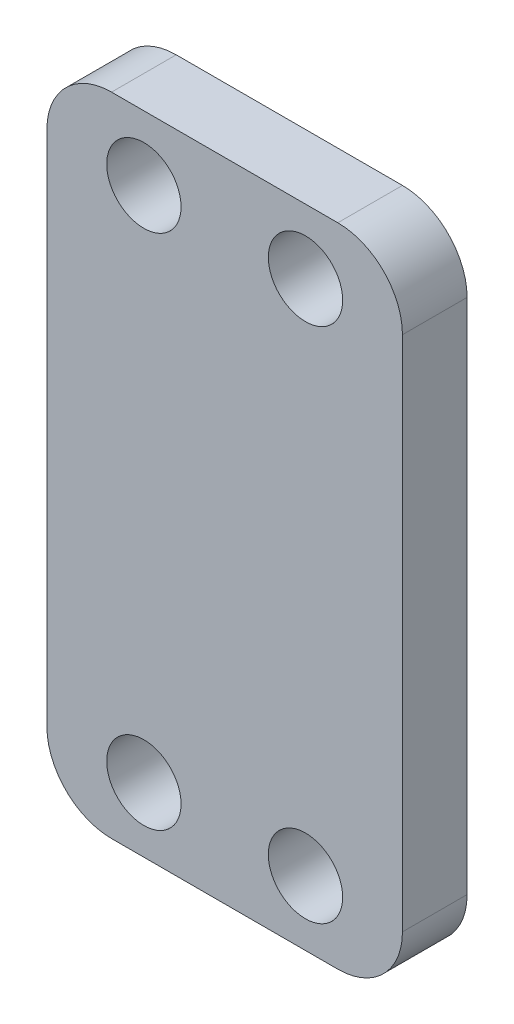
ISO-10303-21;
HEADER;
FILE_DESCRIPTION(('STEP AP214'),'2;1');
FILE_NAME('part.step','',(''),(''),'','','');
FILE_SCHEMA(('AUTOMOTIVE_DESIGN { 1 0 10303 214 1 1 1 1 }'));
ENDSEC;
DATA;
#1=APPLICATION_CONTEXT('core data for automotive mechanical design processes');
#2=APPLICATION_PROTOCOL_DEFINITION('international standard','automotive_design',2000,#1);
#3=PRODUCT_CONTEXT('',#1,'mechanical');
#4=PRODUCT('Part','Part','',(#3));
#5=PRODUCT_RELATED_PRODUCT_CATEGORY('part','',(#4));
#6=PRODUCT_DEFINITION_FORMATION('','',#4);
#7=PRODUCT_DEFINITION_CONTEXT('part definition',#1,'design');
#8=PRODUCT_DEFINITION('design','',#6,#7);
#9=PRODUCT_DEFINITION_SHAPE('','',#8);
#10=(LENGTH_UNIT() NAMED_UNIT(*) SI_UNIT(.MILLI.,.METRE.));
#11=(NAMED_UNIT(*) PLANE_ANGLE_UNIT() SI_UNIT($,.RADIAN.));
#12=(NAMED_UNIT(*) SI_UNIT($,.STERADIAN.) SOLID_ANGLE_UNIT());
#13=UNCERTAINTY_MEASURE_WITH_UNIT(LENGTH_MEASURE(1.E-05),#10,'distance_accuracy_value','');
#14=(GEOMETRIC_REPRESENTATION_CONTEXT(3) GLOBAL_UNCERTAINTY_ASSIGNED_CONTEXT((#13)) GLOBAL_UNIT_ASSIGNED_CONTEXT((#10,
#11,#12)) REPRESENTATION_CONTEXT('',''));
#15=CARTESIAN_POINT('',(0.,0.,0.));
#16=DIRECTION('',(0.,0.,1.));
#17=DIRECTION('',(1.,0.,0.));
#18=AXIS2_PLACEMENT_3D('',#15,#16,#17);
#19=CARTESIAN_POINT('',(5.5,-10.,1.));
#20=DIRECTION('',(-1.,0.,0.));
#21=DIRECTION('',(0.,0.,1.));
#22=AXIS2_PLACEMENT_3D('',#19,#20,#21);
#23=PLANE('',#22);
#24=DIRECTION('',(0.,1.,0.));
#25=VECTOR('',#24,1.);
#26=CARTESIAN_POINT('',(5.5,-10.,1.));
#27=LINE('',#26,#25);
#28=CARTESIAN_POINT('',(5.5,-8.,1.));
#29=VERTEX_POINT('',#28);
#30=CARTESIAN_POINT('',(5.5,8.,1.));
#31=VERTEX_POINT('',#30);
#32=EDGE_CURVE('E127',#29,#31,#27,.T.);
#33=ORIENTED_EDGE('',*,*,#32,.F.);
#34=DIRECTION('',(0.,0.,-1.));
#35=VECTOR('',#34,1.);
#36=CARTESIAN_POINT('',(5.5,-8.,1.));
#37=LINE('',#36,#35);
#38=CARTESIAN_POINT('',(5.5,-8.,-1.));
#39=VERTEX_POINT('',#38);
#40=EDGE_CURVE('E153',#29,#39,#37,.T.);
#41=ORIENTED_EDGE('',*,*,#40,.T.);
#42=DIRECTION('',(0.,1.,0.));
#43=VECTOR('',#42,1.);
#44=CARTESIAN_POINT('',(5.5,-10.,-1.));
#45=LINE('',#44,#43);
#46=CARTESIAN_POINT('',(5.5,8.,-1.));
#47=VERTEX_POINT('',#46);
#48=EDGE_CURVE('E159',#39,#47,#45,.T.);
#49=ORIENTED_EDGE('',*,*,#48,.T.);
#50=DIRECTION('',(0.,0.,-1.));
#51=VECTOR('',#50,1.);
#52=CARTESIAN_POINT('',(5.5,8.,1.));
#53=LINE('',#52,#51);
#54=EDGE_CURVE('E151',#47,#31,#53,.F.);
#55=ORIENTED_EDGE('',*,*,#54,.T.);
#56=EDGE_LOOP('',(#33,#41,#49,#55));
#57=FACE_BOUND('',#56,.T.);
#58=ADVANCED_FACE('F35',(#57),#23,.F.);
#59=CARTESIAN_POINT('',(-5.5,10.,1.));
#60=DIRECTION('',(0.,-1.,0.));
#61=DIRECTION('',(0.,0.,-1.));
#62=AXIS2_PLACEMENT_3D('',#59,#60,#61);
#63=PLANE('',#62);
#64=DIRECTION('',(-1.,0.,0.));
#65=VECTOR('',#64,1.);
#66=CARTESIAN_POINT('',(-5.5,10.,1.));
#67=LINE('',#66,#65);
#68=CARTESIAN_POINT('',(3.5,10.,1.));
#69=VERTEX_POINT('',#68);
#70=CARTESIAN_POINT('',(-3.5,10.,1.));
#71=VERTEX_POINT('',#70);
#72=EDGE_CURVE('E130',#69,#71,#67,.T.);
#73=ORIENTED_EDGE('',*,*,#72,.F.);
#74=DIRECTION('',(0.,0.,-1.));
#75=VECTOR('',#74,1.);
#76=CARTESIAN_POINT('',(3.5,10.,1.));
#77=LINE('',#76,#75);
#78=CARTESIAN_POINT('',(3.5,10.,-1.));
#79=VERTEX_POINT('',#78);
#80=EDGE_CURVE('E11',#69,#79,#77,.T.);
#81=ORIENTED_EDGE('',*,*,#80,.T.);
#82=DIRECTION('',(-1.,0.,0.));
#83=VECTOR('',#82,1.);
#84=CARTESIAN_POINT('',(-5.5,10.,-1.));
#85=LINE('',#84,#83);
#86=CARTESIAN_POINT('',(-3.5,10.,-1.));
#87=VERTEX_POINT('',#86);
#88=EDGE_CURVE('E132',#79,#87,#85,.T.);
#89=ORIENTED_EDGE('',*,*,#88,.T.);
#90=DIRECTION('',(0.,0.,-1.));
#91=VECTOR('',#90,1.);
#92=CARTESIAN_POINT('',(-3.5,10.,1.));
#93=LINE('',#92,#91);
#94=EDGE_CURVE('E43',#87,#71,#93,.F.);
#95=ORIENTED_EDGE('',*,*,#94,.T.);
#96=EDGE_LOOP('',(#73,#81,#89,#95));
#97=FACE_BOUND('',#96,.T.);
#98=ADVANCED_FACE('F218',(#97),#63,.F.);
#99=CARTESIAN_POINT('',(-5.5,-10.,1.));
#100=DIRECTION('',(1.,0.,0.));
#101=DIRECTION('',(0.,0.,-1.));
#102=AXIS2_PLACEMENT_3D('',#99,#100,#101);
#103=PLANE('',#102);
#104=DIRECTION('',(0.,-1.,0.));
#105=VECTOR('',#104,1.);
#106=CARTESIAN_POINT('',(-5.5,-10.,-1.));
#107=LINE('',#106,#105);
#108=CARTESIAN_POINT('',(-5.5,8.,-1.));
#109=VERTEX_POINT('',#108);
#110=CARTESIAN_POINT('',(-5.5,-8.,-1.));
#111=VERTEX_POINT('',#110);
#112=EDGE_CURVE('E128',#109,#111,#107,.T.);
#113=ORIENTED_EDGE('',*,*,#112,.T.);
#114=DIRECTION('',(0.,0.,-1.));
#115=VECTOR('',#114,1.);
#116=CARTESIAN_POINT('',(-5.5,-8.,1.));
#117=LINE('',#116,#115);
#118=CARTESIAN_POINT('',(-5.5,-8.,1.));
#119=VERTEX_POINT('',#118);
#120=EDGE_CURVE('E106',#111,#119,#117,.F.);
#121=ORIENTED_EDGE('',*,*,#120,.T.);
#122=DIRECTION('',(0.,-1.,0.));
#123=VECTOR('',#122,1.);
#124=CARTESIAN_POINT('',(-5.5,-10.,1.));
#125=LINE('',#124,#123);
#126=CARTESIAN_POINT('',(-5.5,8.,1.));
#127=VERTEX_POINT('',#126);
#128=EDGE_CURVE('E171',#127,#119,#125,.T.);
#129=ORIENTED_EDGE('',*,*,#128,.F.);
#130=DIRECTION('',(0.,0.,-1.));
#131=VECTOR('',#130,1.);
#132=CARTESIAN_POINT('',(-5.5,8.,1.));
#133=LINE('',#132,#131);
#134=EDGE_CURVE('E111',#127,#109,#133,.T.);
#135=ORIENTED_EDGE('',*,*,#134,.T.);
#136=EDGE_LOOP('',(#113,#121,#129,#135));
#137=FACE_BOUND('',#136,.T.);
#138=ADVANCED_FACE('F216',(#137),#103,.F.);
#139=CARTESIAN_POINT('',(-5.5,-10.,1.));
#140=DIRECTION('',(0.,1.,0.));
#141=DIRECTION('',(0.,0.,1.));
#142=AXIS2_PLACEMENT_3D('',#139,#140,#141);
#143=PLANE('',#142);
#144=DIRECTION('',(1.,0.,0.));
#145=VECTOR('',#144,1.);
#146=CARTESIAN_POINT('',(-5.5,-10.,1.));
#147=LINE('',#146,#145);
#148=CARTESIAN_POINT('',(-3.5,-10.,1.));
#149=VERTEX_POINT('',#148);
#150=CARTESIAN_POINT('',(3.5,-10.,1.));
#151=VERTEX_POINT('',#150);
#152=EDGE_CURVE('E121',#149,#151,#147,.T.);
#153=ORIENTED_EDGE('',*,*,#152,.F.);
#154=DIRECTION('',(0.,0.,-1.));
#155=VECTOR('',#154,1.);
#156=CARTESIAN_POINT('',(-3.5,-10.,1.));
#157=LINE('',#156,#155);
#158=CARTESIAN_POINT('',(-3.5,-10.,-1.));
#159=VERTEX_POINT('',#158);
#160=EDGE_CURVE('E105',#149,#159,#157,.T.);
#161=ORIENTED_EDGE('',*,*,#160,.T.);
#162=DIRECTION('',(1.,0.,0.));
#163=VECTOR('',#162,1.);
#164=CARTESIAN_POINT('',(-5.5,-10.,-1.));
#165=LINE('',#164,#163);
#166=CARTESIAN_POINT('',(3.5,-10.,-1.));
#167=VERTEX_POINT('',#166);
#168=EDGE_CURVE('E118',#159,#167,#165,.T.);
#169=ORIENTED_EDGE('',*,*,#168,.T.);
#170=DIRECTION('',(0.,0.,-1.));
#171=VECTOR('',#170,1.);
#172=CARTESIAN_POINT('',(3.5,-10.,1.));
#173=LINE('',#172,#171);
#174=EDGE_CURVE('E123',#167,#151,#173,.F.);
#175=ORIENTED_EDGE('',*,*,#174,.T.);
#176=EDGE_LOOP('',(#153,#161,#169,#175));
#177=FACE_BOUND('',#176,.T.);
#178=ADVANCED_FACE('F117',(#177),#143,.F.);
#179=CARTESIAN_POINT('',(0.,0.,1.));
#180=DIRECTION('',(0.,0.,-1.));
#181=DIRECTION('',(-1.,0.,0.));
#182=AXIS2_PLACEMENT_3D('',#179,#180,#181);
#183=PLANE('',#182);
#184=CARTESIAN_POINT('',(2.5,8.,1.));
#185=DIRECTION('',(0.,0.,1.));
#186=DIRECTION('',(1.,0.,0.));
#187=AXIS2_PLACEMENT_3D('',#184,#185,#186);
#188=CIRCLE('',#187,1.15);
#189=CARTESIAN_POINT('',(3.65,8.,1.));
#190=VERTEX_POINT('',#189);
#191=EDGE_CURVE('E185',#190,#190,#188,.T.);
#192=ORIENTED_EDGE('',*,*,#191,.F.);
#193=EDGE_LOOP('',(#192));
#194=FACE_BOUND('',#193,.T.);
#195=CARTESIAN_POINT('',(-2.5,-8.,1.));
#196=DIRECTION('',(0.,0.,1.));
#197=DIRECTION('',(1.,0.,0.));
#198=AXIS2_PLACEMENT_3D('',#195,#196,#197);
#199=CIRCLE('',#198,1.15);
#200=CARTESIAN_POINT('',(-1.35,-8.,1.));
#201=VERTEX_POINT('',#200);
#202=EDGE_CURVE('E178',#201,#201,#199,.T.);
#203=ORIENTED_EDGE('',*,*,#202,.F.);
#204=EDGE_LOOP('',(#203));
#205=FACE_BOUND('',#204,.T.);
#206=CARTESIAN_POINT('',(2.5,-8.,1.));
#207=DIRECTION('',(0.,0.,1.));
#208=DIRECTION('',(1.,0.,0.));
#209=AXIS2_PLACEMENT_3D('',#206,#207,#208);
#210=CIRCLE('',#209,1.15);
#211=CARTESIAN_POINT('',(3.65,-8.,1.));
#212=VERTEX_POINT('',#211);
#213=EDGE_CURVE('E190',#212,#212,#210,.T.);
#214=ORIENTED_EDGE('',*,*,#213,.F.);
#215=EDGE_LOOP('',(#214));
#216=FACE_BOUND('',#215,.T.);
#217=CARTESIAN_POINT('',(-2.5,8.,1.));
#218=DIRECTION('',(0.,0.,1.));
#219=DIRECTION('',(1.,0.,0.));
#220=AXIS2_PLACEMENT_3D('',#217,#218,#219);
#221=CIRCLE('',#220,1.15);
#222=CARTESIAN_POINT('',(-1.35,8.,1.));
#223=VERTEX_POINT('',#222);
#224=EDGE_CURVE('E167',#223,#223,#221,.T.);
#225=ORIENTED_EDGE('',*,*,#224,.F.);
#226=EDGE_LOOP('',(#225));
#227=FACE_BOUND('',#226,.T.);
#228=ORIENTED_EDGE('',*,*,#128,.T.);
#229=CARTESIAN_POINT('',(-3.5,-8.,1.));
#230=DIRECTION('',(0.,0.,-1.));
#231=DIRECTION('',(-1.,0.,0.));
#232=AXIS2_PLACEMENT_3D('',#229,#230,#231);
#233=CIRCLE('',#232,2.);
#234=EDGE_CURVE('E149',#119,#149,#233,.F.);
#235=ORIENTED_EDGE('',*,*,#234,.T.);
#236=ORIENTED_EDGE('',*,*,#152,.T.);
#237=CARTESIAN_POINT('',(3.5,-8.,1.));
#238=DIRECTION('',(0.,0.,-1.));
#239=DIRECTION('',(-1.,0.,0.));
#240=AXIS2_PLACEMENT_3D('',#237,#238,#239);
#241=CIRCLE('',#240,2.);
#242=EDGE_CURVE('E147',#151,#29,#241,.F.);
#243=ORIENTED_EDGE('',*,*,#242,.T.);
#244=ORIENTED_EDGE('',*,*,#32,.T.);
#245=CARTESIAN_POINT('',(3.5,8.,1.));
#246=DIRECTION('',(0.,0.,-1.));
#247=DIRECTION('',(-1.,0.,0.));
#248=AXIS2_PLACEMENT_3D('',#245,#246,#247);
#249=CIRCLE('',#248,2.);
#250=EDGE_CURVE('E56',#31,#69,#249,.F.);
#251=ORIENTED_EDGE('',*,*,#250,.T.);
#252=ORIENTED_EDGE('',*,*,#72,.T.);
#253=CARTESIAN_POINT('',(-3.5,8.,1.));
#254=DIRECTION('',(0.,0.,-1.));
#255=DIRECTION('',(-1.,0.,0.));
#256=AXIS2_PLACEMENT_3D('',#253,#254,#255);
#257=CIRCLE('',#256,2.);
#258=EDGE_CURVE('E144',#71,#127,#257,.F.);
#259=ORIENTED_EDGE('',*,*,#258,.T.);
#260=EDGE_LOOP('',(#228,#235,#236,#243,#244,#251,#252,#259));
#261=FACE_BOUND('',#260,.T.);
#262=ADVANCED_FACE('F206',(#194,#205,#216,#227,#261),#183,.F.);
#263=CARTESIAN_POINT('',(0.,0.,-1.));
#264=DIRECTION('',(0.,0.,-1.));
#265=DIRECTION('',(-1.,0.,0.));
#266=AXIS2_PLACEMENT_3D('',#263,#264,#265);
#267=PLANE('',#266);
#268=CARTESIAN_POINT('',(2.5,8.,-1.));
#269=DIRECTION('',(0.,0.,1.));
#270=DIRECTION('',(1.,0.,0.));
#271=AXIS2_PLACEMENT_3D('',#268,#269,#270);
#272=CIRCLE('',#271,1.15);
#273=CARTESIAN_POINT('',(3.65,8.,-1.));
#274=VERTEX_POINT('',#273);
#275=EDGE_CURVE('E176',#274,#274,#272,.T.);
#276=ORIENTED_EDGE('',*,*,#275,.T.);
#277=EDGE_LOOP('',(#276));
#278=FACE_BOUND('',#277,.T.);
#279=CARTESIAN_POINT('',(-2.5,-8.,-1.));
#280=DIRECTION('',(0.,0.,1.));
#281=DIRECTION('',(1.,0.,0.));
#282=AXIS2_PLACEMENT_3D('',#279,#280,#281);
#283=CIRCLE('',#282,1.15);
#284=CARTESIAN_POINT('',(-1.35,-8.,-1.));
#285=VERTEX_POINT('',#284);
#286=EDGE_CURVE('E181',#285,#285,#283,.T.);
#287=ORIENTED_EDGE('',*,*,#286,.T.);
#288=EDGE_LOOP('',(#287));
#289=FACE_BOUND('',#288,.T.);
#290=CARTESIAN_POINT('',(2.5,-8.,-1.));
#291=DIRECTION('',(0.,0.,1.));
#292=DIRECTION('',(1.,0.,0.));
#293=AXIS2_PLACEMENT_3D('',#290,#291,#292);
#294=CIRCLE('',#293,1.15);
#295=CARTESIAN_POINT('',(3.65,-8.,-1.));
#296=VERTEX_POINT('',#295);
#297=EDGE_CURVE('E182',#296,#296,#294,.T.);
#298=ORIENTED_EDGE('',*,*,#297,.T.);
#299=EDGE_LOOP('',(#298));
#300=FACE_BOUND('',#299,.T.);
#301=CARTESIAN_POINT('',(-2.5,8.,-1.));
#302=DIRECTION('',(0.,0.,1.));
#303=DIRECTION('',(1.,0.,0.));
#304=AXIS2_PLACEMENT_3D('',#301,#302,#303);
#305=CIRCLE('',#304,1.15);
#306=CARTESIAN_POINT('',(-1.35,8.,-1.));
#307=VERTEX_POINT('',#306);
#308=EDGE_CURVE('E164',#307,#307,#305,.T.);
#309=ORIENTED_EDGE('',*,*,#308,.T.);
#310=EDGE_LOOP('',(#309));
#311=FACE_BOUND('',#310,.T.);
#312=ORIENTED_EDGE('',*,*,#168,.F.);
#313=CARTESIAN_POINT('',(-3.5,-8.,-1.));
#314=DIRECTION('',(0.,0.,-1.));
#315=DIRECTION('',(-1.,0.,0.));
#316=AXIS2_PLACEMENT_3D('',#313,#314,#315);
#317=CIRCLE('',#316,2.);
#318=EDGE_CURVE('E101',#159,#111,#317,.T.);
#319=ORIENTED_EDGE('',*,*,#318,.T.);
#320=ORIENTED_EDGE('',*,*,#112,.F.);
#321=CARTESIAN_POINT('',(-3.5,8.,-1.));
#322=DIRECTION('',(0.,0.,-1.));
#323=DIRECTION('',(-1.,0.,0.));
#324=AXIS2_PLACEMENT_3D('',#321,#322,#323);
#325=CIRCLE('',#324,2.);
#326=EDGE_CURVE('E122',#109,#87,#325,.T.);
#327=ORIENTED_EDGE('',*,*,#326,.T.);
#328=ORIENTED_EDGE('',*,*,#88,.F.);
#329=CARTESIAN_POINT('',(3.5,8.,-1.));
#330=DIRECTION('',(0.,0.,-1.));
#331=DIRECTION('',(-1.,0.,0.));
#332=AXIS2_PLACEMENT_3D('',#329,#330,#331);
#333=CIRCLE('',#332,2.);
#334=EDGE_CURVE('E138',#79,#47,#333,.T.);
#335=ORIENTED_EDGE('',*,*,#334,.T.);
#336=ORIENTED_EDGE('',*,*,#48,.F.);
#337=CARTESIAN_POINT('',(3.5,-8.,-1.));
#338=DIRECTION('',(0.,0.,-1.));
#339=DIRECTION('',(-1.,0.,0.));
#340=AXIS2_PLACEMENT_3D('',#337,#338,#339);
#341=CIRCLE('',#340,2.);
#342=EDGE_CURVE('E112',#39,#167,#341,.T.);
#343=ORIENTED_EDGE('',*,*,#342,.T.);
#344=EDGE_LOOP('',(#312,#319,#320,#327,#328,#335,#336,#343));
#345=FACE_BOUND('',#344,.T.);
#346=ADVANCED_FACE('F125',(#278,#289,#300,#311,#345),#267,.T.);
#347=CARTESIAN_POINT('',(-2.5,8.,-1.));
#348=DIRECTION('',(0.,0.,1.));
#349=DIRECTION('',(1.,0.,0.));
#350=AXIS2_PLACEMENT_3D('',#347,#348,#349);
#351=CYLINDRICAL_SURFACE('',#350,1.15);
#352=ORIENTED_EDGE('',*,*,#308,.F.);
#353=EDGE_LOOP('',(#352));
#354=FACE_BOUND('',#353,.T.);
#355=ORIENTED_EDGE('',*,*,#224,.T.);
#356=EDGE_LOOP('',(#355));
#357=FACE_BOUND('',#356,.T.);
#358=ADVANCED_FACE('F202',(#354,#357),#351,.F.);
#359=CARTESIAN_POINT('',(2.5,-8.,-1.));
#360=DIRECTION('',(0.,0.,1.));
#361=DIRECTION('',(1.,0.,0.));
#362=AXIS2_PLACEMENT_3D('',#359,#360,#361);
#363=CYLINDRICAL_SURFACE('',#362,1.15);
#364=ORIENTED_EDGE('',*,*,#297,.F.);
#365=EDGE_LOOP('',(#364));
#366=FACE_BOUND('',#365,.T.);
#367=ORIENTED_EDGE('',*,*,#213,.T.);
#368=EDGE_LOOP('',(#367));
#369=FACE_BOUND('',#368,.T.);
#370=ADVANCED_FACE('F198',(#366,#369),#363,.F.);
#371=CARTESIAN_POINT('',(-2.5,-8.,-1.));
#372=DIRECTION('',(0.,0.,1.));
#373=DIRECTION('',(1.,0.,0.));
#374=AXIS2_PLACEMENT_3D('',#371,#372,#373);
#375=CYLINDRICAL_SURFACE('',#374,1.15);
#376=ORIENTED_EDGE('',*,*,#286,.F.);
#377=EDGE_LOOP('',(#376));
#378=FACE_BOUND('',#377,.T.);
#379=ORIENTED_EDGE('',*,*,#202,.T.);
#380=EDGE_LOOP('',(#379));
#381=FACE_BOUND('',#380,.T.);
#382=ADVANCED_FACE('F201',(#378,#381),#375,.F.);
#383=CARTESIAN_POINT('',(2.5,8.,-1.));
#384=DIRECTION('',(0.,0.,1.));
#385=DIRECTION('',(1.,0.,0.));
#386=AXIS2_PLACEMENT_3D('',#383,#384,#385);
#387=CYLINDRICAL_SURFACE('',#386,1.15);
#388=ORIENTED_EDGE('',*,*,#275,.F.);
#389=EDGE_LOOP('',(#388));
#390=FACE_BOUND('',#389,.T.);
#391=ORIENTED_EDGE('',*,*,#191,.T.);
#392=EDGE_LOOP('',(#391));
#393=FACE_BOUND('',#392,.T.);
#394=ADVANCED_FACE('F229',(#390,#393),#387,.F.);
#395=CARTESIAN_POINT('',(-3.5,-8.,1.));
#396=DIRECTION('',(0.,0.,-1.));
#397=DIRECTION('',(-1.,0.,0.));
#398=AXIS2_PLACEMENT_3D('',#395,#396,#397);
#399=CYLINDRICAL_SURFACE('',#398,2.);
#400=ORIENTED_EDGE('',*,*,#234,.F.);
#401=ORIENTED_EDGE('',*,*,#120,.F.);
#402=ORIENTED_EDGE('',*,*,#318,.F.);
#403=ORIENTED_EDGE('',*,*,#160,.F.);
#404=EDGE_LOOP('',(#400,#401,#402,#403));
#405=FACE_BOUND('',#404,.T.);
#406=ADVANCED_FACE('F104',(#405),#399,.T.);
#407=CARTESIAN_POINT('',(3.5,-8.,1.));
#408=DIRECTION('',(0.,0.,-1.));
#409=DIRECTION('',(-1.,0.,0.));
#410=AXIS2_PLACEMENT_3D('',#407,#408,#409);
#411=CYLINDRICAL_SURFACE('',#410,2.);
#412=ORIENTED_EDGE('',*,*,#242,.F.);
#413=ORIENTED_EDGE('',*,*,#174,.F.);
#414=ORIENTED_EDGE('',*,*,#342,.F.);
#415=ORIENTED_EDGE('',*,*,#40,.F.);
#416=EDGE_LOOP('',(#412,#413,#414,#415));
#417=FACE_BOUND('',#416,.T.);
#418=ADVANCED_FACE('F222',(#417),#411,.T.);
#419=CARTESIAN_POINT('',(3.5,8.,1.));
#420=DIRECTION('',(0.,0.,-1.));
#421=DIRECTION('',(-1.,0.,0.));
#422=AXIS2_PLACEMENT_3D('',#419,#420,#421);
#423=CYLINDRICAL_SURFACE('',#422,2.);
#424=ORIENTED_EDGE('',*,*,#250,.F.);
#425=ORIENTED_EDGE('',*,*,#54,.F.);
#426=ORIENTED_EDGE('',*,*,#334,.F.);
#427=ORIENTED_EDGE('',*,*,#80,.F.);
#428=EDGE_LOOP('',(#424,#425,#426,#427));
#429=FACE_BOUND('',#428,.T.);
#430=ADVANCED_FACE('F221',(#429),#423,.T.);
#431=CARTESIAN_POINT('',(-3.5,8.,1.));
#432=DIRECTION('',(0.,0.,-1.));
#433=DIRECTION('',(-1.,0.,0.));
#434=AXIS2_PLACEMENT_3D('',#431,#432,#433);
#435=CYLINDRICAL_SURFACE('',#434,2.);
#436=ORIENTED_EDGE('',*,*,#258,.F.);
#437=ORIENTED_EDGE('',*,*,#94,.F.);
#438=ORIENTED_EDGE('',*,*,#326,.F.);
#439=ORIENTED_EDGE('',*,*,#134,.F.);
#440=EDGE_LOOP('',(#436,#437,#438,#439));
#441=FACE_BOUND('',#440,.T.);
#442=ADVANCED_FACE('F37',(#441),#435,.T.);
#443=CLOSED_SHELL('',(#58,#98,#138,#178,#262,#346,#358,#370,#382,#394,#406,#418,#430,#442));
#444=MANIFOLD_SOLID_BREP('B2',#443);
#445=ADVANCED_BREP_SHAPE_REPRESENTATION('',(#18,#444),#14);
#446=SHAPE_DEFINITION_REPRESENTATION(#9,#445);
ENDSEC;
END-ISO-10303-21;
